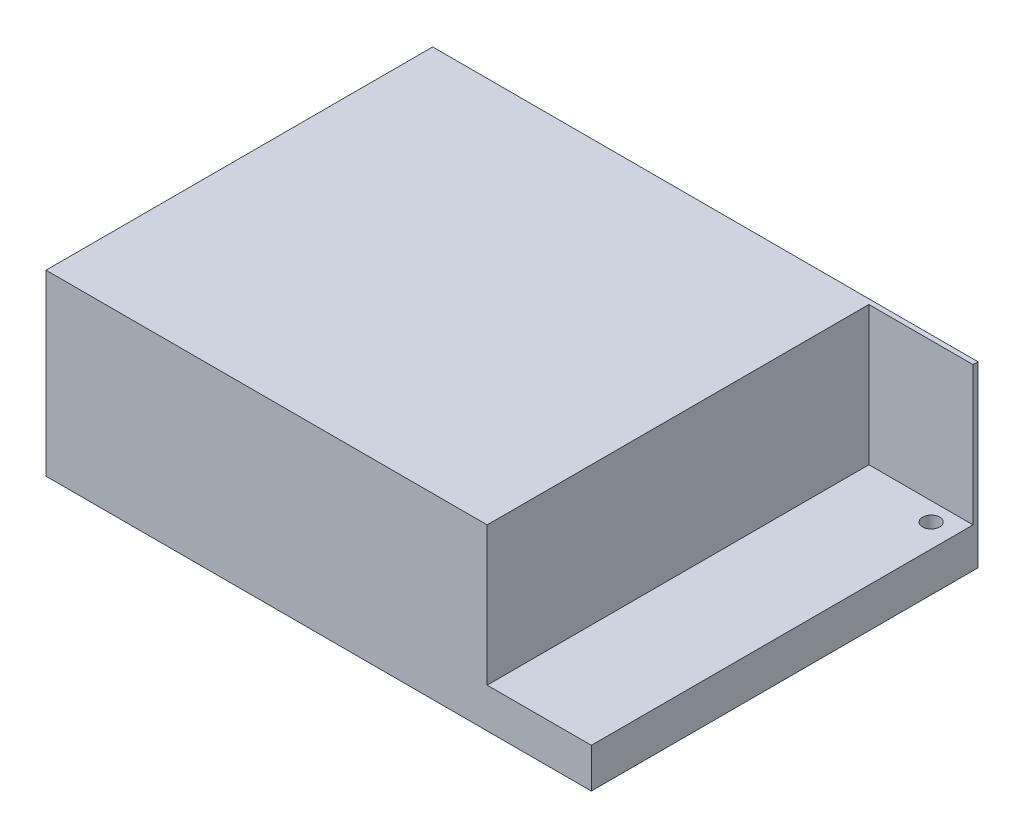
ISO-10303-21;
HEADER;
FILE_DESCRIPTION(('STEP AP214'),'2;1');
FILE_NAME('part.step','',(''),(''),'','','');
FILE_SCHEMA(('AUTOMOTIVE_DESIGN { 1 0 10303 214 1 1 1 1 }'));
ENDSEC;
DATA;
#1=APPLICATION_CONTEXT('core data for automotive mechanical design processes');
#2=APPLICATION_PROTOCOL_DEFINITION('international standard','automotive_design',2000,#1);
#3=PRODUCT_CONTEXT('',#1,'mechanical');
#4=PRODUCT('Part','Part','',(#3));
#5=PRODUCT_RELATED_PRODUCT_CATEGORY('part','',(#4));
#6=PRODUCT_DEFINITION_FORMATION('','',#4);
#7=PRODUCT_DEFINITION_CONTEXT('part definition',#1,'design');
#8=PRODUCT_DEFINITION('design','',#6,#7);
#9=PRODUCT_DEFINITION_SHAPE('','',#8);
#10=(LENGTH_UNIT() NAMED_UNIT(*) SI_UNIT(.MILLI.,.METRE.));
#11=(NAMED_UNIT(*) PLANE_ANGLE_UNIT() SI_UNIT($,.RADIAN.));
#12=(NAMED_UNIT(*) SI_UNIT($,.STERADIAN.) SOLID_ANGLE_UNIT());
#13=UNCERTAINTY_MEASURE_WITH_UNIT(LENGTH_MEASURE(1.E-05),#10,'distance_accuracy_value','');
#14=(GEOMETRIC_REPRESENTATION_CONTEXT(3) GLOBAL_UNCERTAINTY_ASSIGNED_CONTEXT((#13)) GLOBAL_UNIT_ASSIGNED_CONTEXT((#10,
#11,#12)) REPRESENTATION_CONTEXT('',''));
#15=CARTESIAN_POINT('',(0.,0.,0.));
#16=DIRECTION('',(0.,0.,1.));
#17=DIRECTION('',(1.,0.,0.));
#18=AXIS2_PLACEMENT_3D('',#15,#16,#17);
#19=CARTESIAN_POINT('',(-46.9117647058824,36.,-22.9705882352941));
#20=DIRECTION('',(1.,0.,0.));
#21=DIRECTION('',(0.,0.,-1.));
#22=AXIS2_PLACEMENT_3D('',#19,#20,#21);
#23=PLANE('',#22);
#24=DIRECTION('',(0.,0.,1.));
#25=VECTOR('',#24,1.);
#26=CARTESIAN_POINT('',(-46.9117647058824,0.,-22.9705882352941));
#27=LINE('',#26,#25);
#28=CARTESIAN_POINT('',(-46.9117647058824,0.,-22.9705882352941));
#29=VERTEX_POINT('',#28);
#30=CARTESIAN_POINT('',(-46.9117647058824,0.,55.0294117647059));
#31=VERTEX_POINT('',#30);
#32=EDGE_CURVE('E129',#29,#31,#27,.T.);
#33=ORIENTED_EDGE('',*,*,#32,.T.);
#34=DIRECTION('',(0.,-1.,0.));
#35=VECTOR('',#34,1.);
#36=CARTESIAN_POINT('',(-46.9117647058824,36.,55.0294117647059));
#37=LINE('',#36,#35);
#38=CARTESIAN_POINT('',(-46.9117647058824,36.,55.0294117647059));
#39=VERTEX_POINT('',#38);
#40=EDGE_CURVE('E12',#39,#31,#37,.T.);
#41=ORIENTED_EDGE('',*,*,#40,.F.);
#42=DIRECTION('',(0.,0.,1.));
#43=VECTOR('',#42,1.);
#44=CARTESIAN_POINT('',(-46.9117647058824,36.,-22.9705882352941));
#45=LINE('',#44,#43);
#46=CARTESIAN_POINT('',(-46.9117647058824,36.,-22.9705882352941));
#47=VERTEX_POINT('',#46);
#48=EDGE_CURVE('E119',#47,#39,#45,.T.);
#49=ORIENTED_EDGE('',*,*,#48,.F.);
#50=DIRECTION('',(0.,-1.,0.));
#51=VECTOR('',#50,1.);
#52=CARTESIAN_POINT('',(-46.9117647058824,36.,-22.9705882352941));
#53=LINE('',#52,#51);
#54=EDGE_CURVE('E128',#47,#29,#53,.T.);
#55=ORIENTED_EDGE('',*,*,#54,.T.);
#56=EDGE_LOOP('',(#33,#41,#49,#55));
#57=FACE_BOUND('',#56,.T.);
#58=ADVANCED_FACE('F35',(#57),#23,.F.);
#59=CARTESIAN_POINT('',(-46.9117647058824,36.,55.0294117647059));
#60=DIRECTION('',(0.,0.,-1.));
#61=DIRECTION('',(-1.,0.,0.));
#62=AXIS2_PLACEMENT_3D('',#59,#60,#61);
#63=PLANE('',#62);
#64=DIRECTION('',(-1.,0.,0.));
#65=VECTOR('',#64,1.);
#66=CARTESIAN_POINT('',(42.0780602957661,8.00000000000001,55.0294117647059));
#67=LINE('',#66,#65);
#68=CARTESIAN_POINT('',(63.0882352941176,8.00000000000001,55.0294117647059));
#69=VERTEX_POINT('',#68);
#70=CARTESIAN_POINT('',(42.0780602957661,8.00000000000001,55.0294117647059));
#71=VERTEX_POINT('',#70);
#72=EDGE_CURVE('E115',#69,#71,#67,.T.);
#73=ORIENTED_EDGE('',*,*,#72,.T.);
#74=DIRECTION('',(0.,1.,0.));
#75=VECTOR('',#74,1.);
#76=CARTESIAN_POINT('',(42.0780602957661,-79.8149575797755,55.0294117647059));
#77=LINE('',#76,#75);
#78=CARTESIAN_POINT('',(42.0780602957661,36.,55.0294117647059));
#79=VERTEX_POINT('',#78);
#80=EDGE_CURVE('E106',#71,#79,#77,.T.);
#81=ORIENTED_EDGE('',*,*,#80,.T.);
#82=DIRECTION('',(1.,0.,0.));
#83=VECTOR('',#82,1.);
#84=CARTESIAN_POINT('',(-46.9117647058824,36.,55.0294117647059));
#85=LINE('',#84,#83);
#86=EDGE_CURVE('E84',#39,#79,#85,.T.);
#87=ORIENTED_EDGE('',*,*,#86,.F.);
#88=ORIENTED_EDGE('',*,*,#40,.T.);
#89=DIRECTION('',(1.,0.,0.));
#90=VECTOR('',#89,1.);
#91=CARTESIAN_POINT('',(-46.9117647058824,0.,55.0294117647059));
#92=LINE('',#91,#90);
#93=CARTESIAN_POINT('',(63.0882352941176,0.,55.0294117647059));
#94=VERTEX_POINT('',#93);
#95=EDGE_CURVE('E132',#31,#94,#92,.T.);
#96=ORIENTED_EDGE('',*,*,#95,.T.);
#97=DIRECTION('',(0.,-1.,0.));
#98=VECTOR('',#97,1.);
#99=CARTESIAN_POINT('',(63.0882352941176,36.,55.0294117647059));
#100=LINE('',#99,#98);
#101=EDGE_CURVE('E42',#69,#94,#100,.T.);
#102=ORIENTED_EDGE('',*,*,#101,.F.);
#103=EDGE_LOOP('',(#73,#81,#87,#88,#96,#102));
#104=FACE_BOUND('',#103,.T.);
#105=ADVANCED_FACE('F113',(#104),#63,.F.);
#106=CARTESIAN_POINT('',(63.0882352941176,36.,-22.9705882352941));
#107=DIRECTION('',(-1.,0.,0.));
#108=DIRECTION('',(0.,0.,1.));
#109=AXIS2_PLACEMENT_3D('',#106,#107,#108);
#110=PLANE('',#109);
#111=DIRECTION('',(0.,0.,-1.));
#112=VECTOR('',#111,1.);
#113=CARTESIAN_POINT('',(63.0882352941176,36.,-22.9705882352941));
#114=LINE('',#113,#112);
#115=CARTESIAN_POINT('',(63.0882352941176,36.,-21.9705882352941));
#116=VERTEX_POINT('',#115);
#117=CARTESIAN_POINT('',(63.0882352941176,36.,-22.9705882352941));
#118=VERTEX_POINT('',#117);
#119=EDGE_CURVE('E121',#116,#118,#114,.T.);
#120=ORIENTED_EDGE('',*,*,#119,.F.);
#121=DIRECTION('',(0.,1.,0.));
#122=VECTOR('',#121,1.);
#123=CARTESIAN_POINT('',(63.0882352941176,-79.8149575797755,-21.9705882352941));
#124=LINE('',#123,#122);
#125=CARTESIAN_POINT('',(63.0882352941176,8.00000000000001,-21.9705882352941));
#126=VERTEX_POINT('',#125);
#127=EDGE_CURVE('E49',#126,#116,#124,.T.);
#128=ORIENTED_EDGE('',*,*,#127,.F.);
#129=DIRECTION('',(0.,0.,1.));
#130=VECTOR('',#129,1.);
#131=CARTESIAN_POINT('',(63.0882352941176,8.00000000000001,-21.9705882352941));
#132=LINE('',#131,#130);
#133=EDGE_CURVE('E147',#126,#69,#132,.T.);
#134=ORIENTED_EDGE('',*,*,#133,.T.);
#135=ORIENTED_EDGE('',*,*,#101,.T.);
#136=DIRECTION('',(0.,0.,-1.));
#137=VECTOR('',#136,1.);
#138=CARTESIAN_POINT('',(63.0882352941176,0.,-22.9705882352941));
#139=LINE('',#138,#137);
#140=CARTESIAN_POINT('',(63.0882352941176,0.,-22.9705882352941));
#141=VERTEX_POINT('',#140);
#142=EDGE_CURVE('E135',#94,#141,#139,.T.);
#143=ORIENTED_EDGE('',*,*,#142,.T.);
#144=DIRECTION('',(0.,-1.,0.));
#145=VECTOR('',#144,1.);
#146=CARTESIAN_POINT('',(63.0882352941176,36.,-22.9705882352941));
#147=LINE('',#146,#145);
#148=EDGE_CURVE('E139',#118,#141,#147,.T.);
#149=ORIENTED_EDGE('',*,*,#148,.F.);
#150=EDGE_LOOP('',(#120,#128,#134,#135,#143,#149));
#151=FACE_BOUND('',#150,.T.);
#152=ADVANCED_FACE('F143',(#151),#110,.F.);
#153=CARTESIAN_POINT('',(-46.9117647058824,36.,-22.9705882352941));
#154=DIRECTION('',(0.,0.,1.));
#155=DIRECTION('',(1.,0.,0.));
#156=AXIS2_PLACEMENT_3D('',#153,#154,#155);
#157=PLANE('',#156);
#158=DIRECTION('',(-1.,0.,0.));
#159=VECTOR('',#158,1.);
#160=CARTESIAN_POINT('',(-46.9117647058824,0.,-22.9705882352941));
#161=LINE('',#160,#159);
#162=EDGE_CURVE('E78',#141,#29,#161,.T.);
#163=ORIENTED_EDGE('',*,*,#162,.T.);
#164=ORIENTED_EDGE('',*,*,#54,.F.);
#165=DIRECTION('',(-1.,0.,0.));
#166=VECTOR('',#165,1.);
#167=CARTESIAN_POINT('',(-46.9117647058824,36.,-22.9705882352941));
#168=LINE('',#167,#166);
#169=EDGE_CURVE('E58',#118,#47,#168,.T.);
#170=ORIENTED_EDGE('',*,*,#169,.F.);
#171=ORIENTED_EDGE('',*,*,#148,.T.);
#172=EDGE_LOOP('',(#163,#164,#170,#171));
#173=FACE_BOUND('',#172,.T.);
#174=ADVANCED_FACE('F152',(#173),#157,.F.);
#175=CARTESIAN_POINT('',(0.,36.,0.));
#176=DIRECTION('',(0.,1.,0.));
#177=DIRECTION('',(0.,0.,1.));
#178=AXIS2_PLACEMENT_3D('',#175,#176,#177);
#179=PLANE('',#178);
#180=DIRECTION('',(0.,0.,1.));
#181=VECTOR('',#180,1.);
#182=CARTESIAN_POINT('',(42.0780602957661,36.,-21.9705882352941));
#183=LINE('',#182,#181);
#184=CARTESIAN_POINT('',(42.0780602957661,36.,-21.9705882352941));
#185=VERTEX_POINT('',#184);
#186=EDGE_CURVE('E104',#185,#79,#183,.T.);
#187=ORIENTED_EDGE('',*,*,#186,.F.);
#188=DIRECTION('',(-1.,0.,0.));
#189=VECTOR('',#188,1.);
#190=CARTESIAN_POINT('',(42.0780602957661,36.,-21.9705882352941));
#191=LINE('',#190,#189);
#192=EDGE_CURVE('E110',#116,#185,#191,.T.);
#193=ORIENTED_EDGE('',*,*,#192,.F.);
#194=ORIENTED_EDGE('',*,*,#119,.T.);
#195=ORIENTED_EDGE('',*,*,#169,.T.);
#196=ORIENTED_EDGE('',*,*,#48,.T.);
#197=ORIENTED_EDGE('',*,*,#86,.T.);
#198=EDGE_LOOP('',(#187,#193,#194,#195,#196,#197));
#199=FACE_BOUND('',#198,.T.);
#200=ADVANCED_FACE('F117',(#199),#179,.T.);
#201=CARTESIAN_POINT('',(0.,0.,0.));
#202=DIRECTION('',(0.,1.,0.));
#203=DIRECTION('',(0.,0.,1.));
#204=AXIS2_PLACEMENT_3D('',#201,#202,#203);
#205=PLANE('',#204);
#206=CARTESIAN_POINT('',(30.8382352941176,0.,30.7294117647059));
#207=DIRECTION('',(0.,-1.,0.));
#208=DIRECTION('',(0.,0.,-1.));
#209=AXIS2_PLACEMENT_3D('',#206,#207,#208);
#210=CIRCLE('',#209,1.5);
#211=CARTESIAN_POINT('',(30.8382352941176,0.,29.2294117647059));
#212=VERTEX_POINT('',#211);
#213=EDGE_CURVE('E181',#212,#212,#210,.T.);
#214=ORIENTED_EDGE('',*,*,#213,.F.);
#215=EDGE_LOOP('',(#214));
#216=FACE_BOUND('',#215,.T.);
#217=CARTESIAN_POINT('',(-4.91176470588236,0.,30.7294117647059));
#218=DIRECTION('',(0.,-1.,0.));
#219=DIRECTION('',(0.,0.,-1.));
#220=AXIS2_PLACEMENT_3D('',#217,#218,#219);
#221=CIRCLE('',#220,1.5);
#222=CARTESIAN_POINT('',(-4.91176470588236,0.,29.2294117647059));
#223=VERTEX_POINT('',#222);
#224=EDGE_CURVE('E175',#223,#223,#221,.T.);
#225=ORIENTED_EDGE('',*,*,#224,.F.);
#226=EDGE_LOOP('',(#225));
#227=FACE_BOUND('',#226,.T.);
#228=CARTESIAN_POINT('',(-4.91176470588236,0.,2.12941176470588));
#229=DIRECTION('',(0.,-1.,0.));
#230=DIRECTION('',(0.,0.,-1.));
#231=AXIS2_PLACEMENT_3D('',#228,#229,#230);
#232=CIRCLE('',#231,1.5);
#233=CARTESIAN_POINT('',(-4.91176470588236,0.,0.629411764705877));
#234=VERTEX_POINT('',#233);
#235=EDGE_CURVE('E169',#234,#234,#232,.T.);
#236=ORIENTED_EDGE('',*,*,#235,.F.);
#237=EDGE_LOOP('',(#236));
#238=FACE_BOUND('',#237,.T.);
#239=CARTESIAN_POINT('',(58.3632352941176,0.,-18.2455882352941));
#240=DIRECTION('',(0.,1.,0.));
#241=DIRECTION('',(0.,0.,1.));
#242=AXIS2_PLACEMENT_3D('',#239,#240,#241);
#243=CIRCLE('',#242,1.725);
#244=CARTESIAN_POINT('',(58.3632352941176,0.,-16.5205882352941));
#245=VERTEX_POINT('',#244);
#246=EDGE_CURVE('E111',#245,#245,#243,.T.);
#247=ORIENTED_EDGE('',*,*,#246,.T.);
#248=EDGE_LOOP('',(#247));
#249=FACE_BOUND('',#248,.T.);
#250=ORIENTED_EDGE('',*,*,#32,.F.);
#251=ORIENTED_EDGE('',*,*,#162,.F.);
#252=ORIENTED_EDGE('',*,*,#142,.F.);
#253=ORIENTED_EDGE('',*,*,#95,.F.);
#254=EDGE_LOOP('',(#250,#251,#252,#253));
#255=FACE_BOUND('',#254,.T.);
#256=ADVANCED_FACE('F150',(#216,#227,#238,#249,#255),#205,.F.);
#257=CARTESIAN_POINT('',(42.0780602957661,-79.8149575797755,-21.9705882352941));
#258=DIRECTION('',(-1.,0.,0.));
#259=DIRECTION('',(0.,0.,1.));
#260=AXIS2_PLACEMENT_3D('',#257,#258,#259);
#261=PLANE('',#260);
#262=DIRECTION('',(0.,0.,-1.));
#263=VECTOR('',#262,1.);
#264=CARTESIAN_POINT('',(42.0780602957661,8.00000000000001,-21.9705882352941));
#265=LINE('',#264,#263);
#266=CARTESIAN_POINT('',(42.0780602957661,8.00000000000001,-21.9705882352941));
#267=VERTEX_POINT('',#266);
#268=EDGE_CURVE('E157',#71,#267,#265,.T.);
#269=ORIENTED_EDGE('',*,*,#268,.T.);
#270=DIRECTION('',(0.,1.,0.));
#271=VECTOR('',#270,1.);
#272=CARTESIAN_POINT('',(42.0780602957661,-79.8149575797755,-21.9705882352941));
#273=LINE('',#272,#271);
#274=EDGE_CURVE('E109',#267,#185,#273,.T.);
#275=ORIENTED_EDGE('',*,*,#274,.T.);
#276=ORIENTED_EDGE('',*,*,#186,.T.);
#277=ORIENTED_EDGE('',*,*,#80,.F.);
#278=EDGE_LOOP('',(#269,#275,#276,#277));
#279=FACE_BOUND('',#278,.T.);
#280=ADVANCED_FACE('F105',(#279),#261,.F.);
#281=CARTESIAN_POINT('',(42.0780602957661,-79.8149575797755,-21.9705882352941));
#282=DIRECTION('',(0.,0.,-1.));
#283=DIRECTION('',(-1.,0.,0.));
#284=AXIS2_PLACEMENT_3D('',#281,#282,#283);
#285=PLANE('',#284);
#286=DIRECTION('',(1.,0.,0.));
#287=VECTOR('',#286,1.);
#288=CARTESIAN_POINT('',(42.0780602957661,8.00000000000001,-21.9705882352941));
#289=LINE('',#288,#287);
#290=EDGE_CURVE('E158',#267,#126,#289,.T.);
#291=ORIENTED_EDGE('',*,*,#290,.T.);
#292=ORIENTED_EDGE('',*,*,#127,.T.);
#293=ORIENTED_EDGE('',*,*,#192,.T.);
#294=ORIENTED_EDGE('',*,*,#274,.F.);
#295=EDGE_LOOP('',(#291,#292,#293,#294));
#296=FACE_BOUND('',#295,.T.);
#297=ADVANCED_FACE('F215',(#296),#285,.F.);
#298=CARTESIAN_POINT('',(0.,8.,0.));
#299=DIRECTION('',(0.,1.,0.));
#300=DIRECTION('',(0.,0.,1.));
#301=AXIS2_PLACEMENT_3D('',#298,#299,#300);
#302=PLANE('',#301);
#303=CARTESIAN_POINT('',(58.3632352941176,8.,-18.2455882352941));
#304=DIRECTION('',(0.,1.,0.));
#305=DIRECTION('',(0.,0.,1.));
#306=AXIS2_PLACEMENT_3D('',#303,#304,#305);
#307=CIRCLE('',#306,1.725);
#308=CARTESIAN_POINT('',(58.3632352941176,8.,-16.5205882352941));
#309=VERTEX_POINT('',#308);
#310=EDGE_CURVE('E163',#309,#309,#307,.T.);
#311=ORIENTED_EDGE('',*,*,#310,.F.);
#312=EDGE_LOOP('',(#311));
#313=FACE_BOUND('',#312,.T.);
#314=ORIENTED_EDGE('',*,*,#268,.F.);
#315=ORIENTED_EDGE('',*,*,#72,.F.);
#316=ORIENTED_EDGE('',*,*,#133,.F.);
#317=ORIENTED_EDGE('',*,*,#290,.F.);
#318=EDGE_LOOP('',(#314,#315,#316,#317));
#319=FACE_BOUND('',#318,.T.);
#320=ADVANCED_FACE('F209',(#313,#319),#302,.T.);
#321=CARTESIAN_POINT('',(58.3632352941176,0.,-18.2455882352941));
#322=DIRECTION('',(0.,1.,0.));
#323=DIRECTION('',(0.,0.,1.));
#324=AXIS2_PLACEMENT_3D('',#321,#322,#323);
#325=CYLINDRICAL_SURFACE('',#324,1.725);
#326=ORIENTED_EDGE('',*,*,#246,.F.);
#327=EDGE_LOOP('',(#326));
#328=FACE_BOUND('',#327,.T.);
#329=ORIENTED_EDGE('',*,*,#310,.T.);
#330=EDGE_LOOP('',(#329));
#331=FACE_BOUND('',#330,.T.);
#332=ADVANCED_FACE('F205',(#328,#331),#325,.F.);
#333=CARTESIAN_POINT('',(-4.91176470588236,5.,2.12941176470588));
#334=DIRECTION('',(0.,-1.,0.));
#335=DIRECTION('',(0.,0.,-1.));
#336=AXIS2_PLACEMENT_3D('',#333,#334,#335);
#337=CYLINDRICAL_SURFACE('',#336,1.5);
#338=CARTESIAN_POINT('',(-4.91176470588236,5.,2.12941176470588));
#339=DIRECTION('',(0.,-1.,0.));
#340=DIRECTION('',(0.,0.,-1.));
#341=AXIS2_PLACEMENT_3D('',#338,#339,#340);
#342=CIRCLE('',#341,1.5);
#343=CARTESIAN_POINT('',(-4.91176470588236,5.,0.629411764705877));
#344=VERTEX_POINT('',#343);
#345=EDGE_CURVE('E166',#344,#344,#342,.T.);
#346=ORIENTED_EDGE('',*,*,#345,.F.);
#347=EDGE_LOOP('',(#346));
#348=FACE_BOUND('',#347,.T.);
#349=ORIENTED_EDGE('',*,*,#235,.T.);
#350=EDGE_LOOP('',(#349));
#351=FACE_BOUND('',#350,.T.);
#352=ADVANCED_FACE('F208',(#348,#351),#337,.F.);
#353=CARTESIAN_POINT('',(-4.91176470588236,5.,2.12941176470588));
#354=DIRECTION('',(0.,-1.,0.));
#355=DIRECTION('',(0.,0.,-1.));
#356=AXIS2_PLACEMENT_3D('',#353,#354,#355);
#357=PLANE('',#356);
#358=ORIENTED_EDGE('',*,*,#345,.T.);
#359=EDGE_LOOP('',(#358));
#360=FACE_BOUND('',#359,.T.);
#361=ADVANCED_FACE('F273',(#360),#357,.T.);
#362=CARTESIAN_POINT('',(-4.91176470588236,5.,30.7294117647059));
#363=DIRECTION('',(0.,-1.,0.));
#364=DIRECTION('',(0.,0.,-1.));
#365=AXIS2_PLACEMENT_3D('',#362,#363,#364);
#366=CYLINDRICAL_SURFACE('',#365,1.5);
#367=CARTESIAN_POINT('',(-4.91176470588236,5.,30.7294117647059));
#368=DIRECTION('',(0.,-1.,0.));
#369=DIRECTION('',(0.,0.,-1.));
#370=AXIS2_PLACEMENT_3D('',#367,#368,#369);
#371=CIRCLE('',#370,1.5);
#372=CARTESIAN_POINT('',(-4.91176470588236,5.,29.2294117647059));
#373=VERTEX_POINT('',#372);
#374=EDGE_CURVE('E172',#373,#373,#371,.T.);
#375=ORIENTED_EDGE('',*,*,#374,.F.);
#376=EDGE_LOOP('',(#375));
#377=FACE_BOUND('',#376,.T.);
#378=ORIENTED_EDGE('',*,*,#224,.T.);
#379=EDGE_LOOP('',(#378));
#380=FACE_BOUND('',#379,.T.);
#381=ADVANCED_FACE('F280',(#377,#380),#366,.F.);
#382=CARTESIAN_POINT('',(-4.91176470588236,5.,30.7294117647059));
#383=DIRECTION('',(0.,-1.,0.));
#384=DIRECTION('',(0.,0.,-1.));
#385=AXIS2_PLACEMENT_3D('',#382,#383,#384);
#386=PLANE('',#385);
#387=ORIENTED_EDGE('',*,*,#374,.T.);
#388=EDGE_LOOP('',(#387));
#389=FACE_BOUND('',#388,.T.);
#390=ADVANCED_FACE('F192',(#389),#386,.T.);
#391=CARTESIAN_POINT('',(30.8382352941176,5.,30.7294117647059));
#392=DIRECTION('',(0.,-1.,0.));
#393=DIRECTION('',(0.,0.,-1.));
#394=AXIS2_PLACEMENT_3D('',#391,#392,#393);
#395=CYLINDRICAL_SURFACE('',#394,1.5);
#396=CARTESIAN_POINT('',(30.8382352941176,5.,30.7294117647059));
#397=DIRECTION('',(0.,-1.,0.));
#398=DIRECTION('',(0.,0.,-1.));
#399=AXIS2_PLACEMENT_3D('',#396,#397,#398);
#400=CIRCLE('',#399,1.5);
#401=CARTESIAN_POINT('',(30.8382352941176,5.,29.2294117647059));
#402=VERTEX_POINT('',#401);
#403=EDGE_CURVE('E178',#402,#402,#400,.T.);
#404=ORIENTED_EDGE('',*,*,#403,.F.);
#405=EDGE_LOOP('',(#404));
#406=FACE_BOUND('',#405,.T.);
#407=ORIENTED_EDGE('',*,*,#213,.T.);
#408=EDGE_LOOP('',(#407));
#409=FACE_BOUND('',#408,.T.);
#410=ADVANCED_FACE('F189',(#406,#409),#395,.F.);
#411=CARTESIAN_POINT('',(30.8382352941176,5.,30.7294117647059));
#412=DIRECTION('',(0.,-1.,0.));
#413=DIRECTION('',(0.,0.,-1.));
#414=AXIS2_PLACEMENT_3D('',#411,#412,#413);
#415=PLANE('',#414);
#416=ORIENTED_EDGE('',*,*,#403,.T.);
#417=EDGE_LOOP('',(#416));
#418=FACE_BOUND('',#417,.T.);
#419=ADVANCED_FACE('F187',(#418),#415,.T.);
#420=CLOSED_SHELL('',(#58,#105,#152,#174,#200,#256,#280,#297,#320,#332,#352,#361,#381,#390,#410,#419));
#421=MANIFOLD_SOLID_BREP('B2',#420);
#422=ADVANCED_BREP_SHAPE_REPRESENTATION('',(#18,#421),#14);
#423=SHAPE_DEFINITION_REPRESENTATION(#9,#422);
ENDSEC;
END-ISO-10303-21;
